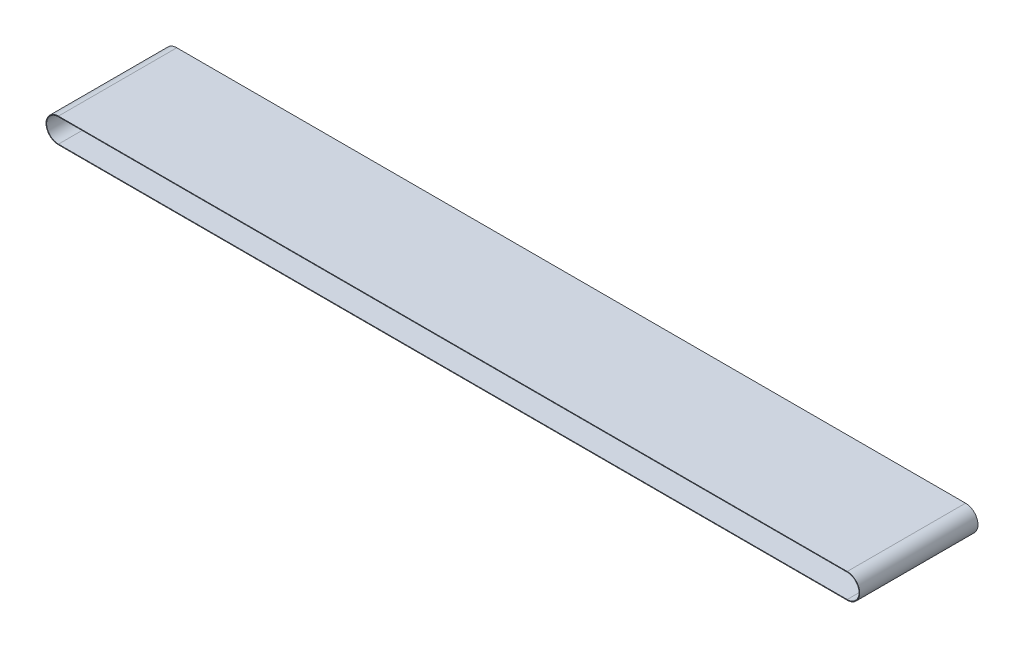
ISO-10303-21;
HEADER;
FILE_DESCRIPTION(('STEP AP214'),'2;1');
FILE_NAME('part.step','',(''),(''),'','','');
FILE_SCHEMA(('AUTOMOTIVE_DESIGN { 1 0 10303 214 1 1 1 1 }'));
ENDSEC;
DATA;
#1=APPLICATION_CONTEXT('core data for automotive mechanical design processes');
#2=APPLICATION_PROTOCOL_DEFINITION('international standard','automotive_design',2000,#1);
#3=PRODUCT_CONTEXT('',#1,'mechanical');
#4=PRODUCT('Part','Part','',(#3));
#5=PRODUCT_RELATED_PRODUCT_CATEGORY('part','',(#4));
#6=PRODUCT_DEFINITION_FORMATION('','',#4);
#7=PRODUCT_DEFINITION_CONTEXT('part definition',#1,'design');
#8=PRODUCT_DEFINITION('design','',#6,#7);
#9=PRODUCT_DEFINITION_SHAPE('','',#8);
#10=(LENGTH_UNIT() NAMED_UNIT(*) SI_UNIT(.MILLI.,.METRE.));
#11=(NAMED_UNIT(*) PLANE_ANGLE_UNIT() SI_UNIT($,.RADIAN.));
#12=(NAMED_UNIT(*) SI_UNIT($,.STERADIAN.) SOLID_ANGLE_UNIT());
#13=UNCERTAINTY_MEASURE_WITH_UNIT(LENGTH_MEASURE(1.E-05),#10,'distance_accuracy_value','');
#14=(GEOMETRIC_REPRESENTATION_CONTEXT(3) GLOBAL_UNCERTAINTY_ASSIGNED_CONTEXT((#13)) GLOBAL_UNIT_ASSIGNED_CONTEXT((#10,
#11,#12)) REPRESENTATION_CONTEXT('',''));
#15=CARTESIAN_POINT('',(0.,0.,0.));
#16=DIRECTION('',(0.,0.,1.));
#17=DIRECTION('',(1.,0.,0.));
#18=AXIS2_PLACEMENT_3D('',#15,#16,#17);
#19=CARTESIAN_POINT('',(0.,0.,75.));
#20=DIRECTION('',(0.,0.,1.));
#21=DIRECTION('',(1.,0.,0.));
#22=AXIS2_PLACEMENT_3D('',#19,#20,#21);
#23=PLANE('',#22);
#24=CARTESIAN_POINT('',(0.,0.,75.));
#25=DIRECTION('',(0.,0.,1.));
#26=DIRECTION('',(1.,0.,0.));
#27=AXIS2_PLACEMENT_3D('',#24,#25,#26);
#28=CIRCLE('',#27,15.8);
#29=CARTESIAN_POINT('',(0.,15.8,75.));
#30=VERTEX_POINT('',#29);
#31=CARTESIAN_POINT('',(0.,-15.8,75.));
#32=VERTEX_POINT('',#31);
#33=EDGE_CURVE('E135',#30,#32,#28,.T.);
#34=ORIENTED_EDGE('',*,*,#33,.T.);
#35=DIRECTION('',(1.,0.,0.));
#36=VECTOR('',#35,1.);
#37=CARTESIAN_POINT('',(0.,-15.8,75.));
#38=LINE('',#37,#36);
#39=CARTESIAN_POINT('',(1000.,-15.8,75.));
#40=VERTEX_POINT('',#39);
#41=EDGE_CURVE('E138',#32,#40,#38,.T.);
#42=ORIENTED_EDGE('',*,*,#41,.T.);
#43=CARTESIAN_POINT('',(1000.,0.,75.));
#44=DIRECTION('',(0.,0.,1.));
#45=DIRECTION('',(1.,0.,0.));
#46=AXIS2_PLACEMENT_3D('',#43,#44,#45);
#47=CIRCLE('',#46,15.8);
#48=CARTESIAN_POINT('',(1000.,15.8,75.));
#49=VERTEX_POINT('',#48);
#50=EDGE_CURVE('E141',#40,#49,#47,.T.);
#51=ORIENTED_EDGE('',*,*,#50,.T.);
#52=DIRECTION('',(-1.,0.,0.));
#53=VECTOR('',#52,1.);
#54=CARTESIAN_POINT('',(0.,15.8,75.));
#55=LINE('',#54,#53);
#56=EDGE_CURVE('E143',#49,#30,#55,.T.);
#57=ORIENTED_EDGE('',*,*,#56,.T.);
#58=EDGE_LOOP('',(#34,#42,#51,#57));
#59=FACE_BOUND('',#58,.T.);
#60=DIRECTION('',(1.,0.,0.));
#61=VECTOR('',#60,1.);
#62=CARTESIAN_POINT('',(0.,-15.,75.));
#63=LINE('',#62,#61);
#64=CARTESIAN_POINT('',(0.,-15.,75.));
#65=VERTEX_POINT('',#64);
#66=CARTESIAN_POINT('',(1000.,-15.,75.));
#67=VERTEX_POINT('',#66);
#68=EDGE_CURVE('E107',#65,#67,#63,.T.);
#69=ORIENTED_EDGE('',*,*,#68,.F.);
#70=CARTESIAN_POINT('',(0.,0.,75.));
#71=DIRECTION('',(0.,0.,1.));
#72=DIRECTION('',(1.,0.,0.));
#73=AXIS2_PLACEMENT_3D('',#70,#71,#72);
#74=CIRCLE('',#73,15.);
#75=CARTESIAN_POINT('',(0.,15.,75.));
#76=VERTEX_POINT('',#75);
#77=EDGE_CURVE('E99',#76,#65,#74,.T.);
#78=ORIENTED_EDGE('',*,*,#77,.F.);
#79=DIRECTION('',(-1.,0.,0.));
#80=VECTOR('',#79,1.);
#81=CARTESIAN_POINT('',(0.,15.,75.));
#82=LINE('',#81,#80);
#83=CARTESIAN_POINT('',(1000.,15.,75.));
#84=VERTEX_POINT('',#83);
#85=EDGE_CURVE('E121',#84,#76,#82,.T.);
#86=ORIENTED_EDGE('',*,*,#85,.F.);
#87=CARTESIAN_POINT('',(1000.,0.,75.));
#88=DIRECTION('',(0.,0.,1.));
#89=DIRECTION('',(1.,0.,0.));
#90=AXIS2_PLACEMENT_3D('',#87,#88,#89);
#91=CIRCLE('',#90,15.);
#92=EDGE_CURVE('E119',#67,#84,#91,.T.);
#93=ORIENTED_EDGE('',*,*,#92,.F.);
#94=EDGE_LOOP('',(#69,#78,#86,#93));
#95=FACE_BOUND('',#94,.T.);
#96=ADVANCED_FACE('F34',(#59,#95),#23,.T.);
#97=CARTESIAN_POINT('',(0.,0.,-75.));
#98=DIRECTION('',(0.,0.,1.));
#99=DIRECTION('',(1.,0.,0.));
#100=AXIS2_PLACEMENT_3D('',#97,#98,#99);
#101=PLANE('',#100);
#102=CARTESIAN_POINT('',(0.,0.,-75.));
#103=DIRECTION('',(0.,0.,1.));
#104=DIRECTION('',(1.,0.,0.));
#105=AXIS2_PLACEMENT_3D('',#102,#103,#104);
#106=CIRCLE('',#105,15.8);
#107=CARTESIAN_POINT('',(0.,15.8,-75.));
#108=VERTEX_POINT('',#107);
#109=CARTESIAN_POINT('',(0.,-15.8,-75.));
#110=VERTEX_POINT('',#109);
#111=EDGE_CURVE('E115',#108,#110,#106,.T.);
#112=ORIENTED_EDGE('',*,*,#111,.F.);
#113=DIRECTION('',(-1.,0.,0.));
#114=VECTOR('',#113,1.);
#115=CARTESIAN_POINT('',(0.,15.8,-75.));
#116=LINE('',#115,#114);
#117=CARTESIAN_POINT('',(1000.,15.8,-75.));
#118=VERTEX_POINT('',#117);
#119=EDGE_CURVE('E139',#118,#108,#116,.T.);
#120=ORIENTED_EDGE('',*,*,#119,.F.);
#121=CARTESIAN_POINT('',(1000.,0.,-75.));
#122=DIRECTION('',(0.,0.,1.));
#123=DIRECTION('',(1.,0.,0.));
#124=AXIS2_PLACEMENT_3D('',#121,#122,#123);
#125=CIRCLE('',#124,15.8);
#126=CARTESIAN_POINT('',(1000.,-15.8,-75.));
#127=VERTEX_POINT('',#126);
#128=EDGE_CURVE('E150',#127,#118,#125,.T.);
#129=ORIENTED_EDGE('',*,*,#128,.F.);
#130=DIRECTION('',(1.,0.,0.));
#131=VECTOR('',#130,1.);
#132=CARTESIAN_POINT('',(0.,-15.8,-75.));
#133=LINE('',#132,#131);
#134=EDGE_CURVE('E148',#110,#127,#133,.T.);
#135=ORIENTED_EDGE('',*,*,#134,.F.);
#136=EDGE_LOOP('',(#112,#120,#129,#135));
#137=FACE_BOUND('',#136,.T.);
#138=CARTESIAN_POINT('',(0.,0.,-75.));
#139=DIRECTION('',(0.,0.,1.));
#140=DIRECTION('',(1.,0.,0.));
#141=AXIS2_PLACEMENT_3D('',#138,#139,#140);
#142=CIRCLE('',#141,15.);
#143=CARTESIAN_POINT('',(0.,15.,-75.));
#144=VERTEX_POINT('',#143);
#145=CARTESIAN_POINT('',(0.,-15.,-75.));
#146=VERTEX_POINT('',#145);
#147=EDGE_CURVE('E57',#144,#146,#142,.T.);
#148=ORIENTED_EDGE('',*,*,#147,.T.);
#149=DIRECTION('',(1.,0.,0.));
#150=VECTOR('',#149,1.);
#151=CARTESIAN_POINT('',(0.,-15.,-75.));
#152=LINE('',#151,#150);
#153=CARTESIAN_POINT('',(1000.,-15.,-75.));
#154=VERTEX_POINT('',#153);
#155=EDGE_CURVE('E114',#146,#154,#152,.T.);
#156=ORIENTED_EDGE('',*,*,#155,.T.);
#157=CARTESIAN_POINT('',(1000.,0.,-75.));
#158=DIRECTION('',(0.,0.,1.));
#159=DIRECTION('',(1.,0.,0.));
#160=AXIS2_PLACEMENT_3D('',#157,#158,#159);
#161=CIRCLE('',#160,15.);
#162=CARTESIAN_POINT('',(1000.,15.,-75.));
#163=VERTEX_POINT('',#162);
#164=EDGE_CURVE('E127',#154,#163,#161,.T.);
#165=ORIENTED_EDGE('',*,*,#164,.T.);
#166=DIRECTION('',(-1.,0.,0.));
#167=VECTOR('',#166,1.);
#168=CARTESIAN_POINT('',(0.,15.,-75.));
#169=LINE('',#168,#167);
#170=EDGE_CURVE('E108',#163,#144,#169,.T.);
#171=ORIENTED_EDGE('',*,*,#170,.T.);
#172=EDGE_LOOP('',(#148,#156,#165,#171));
#173=FACE_BOUND('',#172,.T.);
#174=ADVANCED_FACE('F168',(#137,#173),#101,.F.);
#175=CARTESIAN_POINT('',(0.,0.,75.));
#176=DIRECTION('',(0.,0.,-1.));
#177=DIRECTION('',(-1.,0.,0.));
#178=AXIS2_PLACEMENT_3D('',#175,#176,#177);
#179=CYLINDRICAL_SURFACE('',#178,15.8);
#180=ORIENTED_EDGE('',*,*,#111,.T.);
#181=DIRECTION('',(0.,0.,-1.));
#182=VECTOR('',#181,1.);
#183=CARTESIAN_POINT('',(0.,-15.8,75.));
#184=LINE('',#183,#182);
#185=EDGE_CURVE('E11',#32,#110,#184,.T.);
#186=ORIENTED_EDGE('',*,*,#185,.F.);
#187=ORIENTED_EDGE('',*,*,#33,.F.);
#188=DIRECTION('',(0.,0.,-1.));
#189=VECTOR('',#188,1.);
#190=CARTESIAN_POINT('',(0.,15.8,75.));
#191=LINE('',#190,#189);
#192=EDGE_CURVE('E145',#30,#108,#191,.T.);
#193=ORIENTED_EDGE('',*,*,#192,.T.);
#194=EDGE_LOOP('',(#180,#186,#187,#193));
#195=FACE_BOUND('',#194,.T.);
#196=ADVANCED_FACE('F36',(#195),#179,.T.);
#197=CARTESIAN_POINT('',(0.,-15.8,75.));
#198=DIRECTION('',(0.,1.,0.));
#199=DIRECTION('',(0.,0.,1.));
#200=AXIS2_PLACEMENT_3D('',#197,#198,#199);
#201=PLANE('',#200);
#202=ORIENTED_EDGE('',*,*,#134,.T.);
#203=DIRECTION('',(0.,0.,-1.));
#204=VECTOR('',#203,1.);
#205=CARTESIAN_POINT('',(1000.,-15.8,75.));
#206=LINE('',#205,#204);
#207=EDGE_CURVE('E42',#40,#127,#206,.T.);
#208=ORIENTED_EDGE('',*,*,#207,.F.);
#209=ORIENTED_EDGE('',*,*,#41,.F.);
#210=ORIENTED_EDGE('',*,*,#185,.T.);
#211=EDGE_LOOP('',(#202,#208,#209,#210));
#212=FACE_BOUND('',#211,.T.);
#213=ADVANCED_FACE('F178',(#212),#201,.F.);
#214=CARTESIAN_POINT('',(1000.,0.,75.));
#215=DIRECTION('',(0.,0.,-1.));
#216=DIRECTION('',(-1.,0.,0.));
#217=AXIS2_PLACEMENT_3D('',#214,#215,#216);
#218=CYLINDRICAL_SURFACE('',#217,15.8);
#219=ORIENTED_EDGE('',*,*,#128,.T.);
#220=DIRECTION('',(0.,0.,-1.));
#221=VECTOR('',#220,1.);
#222=CARTESIAN_POINT('',(1000.,15.8,75.));
#223=LINE('',#222,#221);
#224=EDGE_CURVE('E155',#49,#118,#223,.T.);
#225=ORIENTED_EDGE('',*,*,#224,.F.);
#226=ORIENTED_EDGE('',*,*,#50,.F.);
#227=ORIENTED_EDGE('',*,*,#207,.T.);
#228=EDGE_LOOP('',(#219,#225,#226,#227));
#229=FACE_BOUND('',#228,.T.);
#230=ADVANCED_FACE('F162',(#229),#218,.T.);
#231=CARTESIAN_POINT('',(0.,15.8,75.));
#232=DIRECTION('',(0.,-1.,0.));
#233=DIRECTION('',(0.,0.,-1.));
#234=AXIS2_PLACEMENT_3D('',#231,#232,#233);
#235=PLANE('',#234);
#236=ORIENTED_EDGE('',*,*,#119,.T.);
#237=ORIENTED_EDGE('',*,*,#192,.F.);
#238=ORIENTED_EDGE('',*,*,#56,.F.);
#239=ORIENTED_EDGE('',*,*,#224,.T.);
#240=EDGE_LOOP('',(#236,#237,#238,#239));
#241=FACE_BOUND('',#240,.T.);
#242=ADVANCED_FACE('F172',(#241),#235,.F.);
#243=CARTESIAN_POINT('',(0.,0.,75.));
#244=DIRECTION('',(0.,0.,-1.));
#245=DIRECTION('',(-1.,0.,0.));
#246=AXIS2_PLACEMENT_3D('',#243,#244,#245);
#247=CYLINDRICAL_SURFACE('',#246,15.);
#248=ORIENTED_EDGE('',*,*,#147,.F.);
#249=DIRECTION('',(0.,0.,-1.));
#250=VECTOR('',#249,1.);
#251=CARTESIAN_POINT('',(0.,15.,75.));
#252=LINE('',#251,#250);
#253=EDGE_CURVE('E103',#76,#144,#252,.T.);
#254=ORIENTED_EDGE('',*,*,#253,.F.);
#255=ORIENTED_EDGE('',*,*,#77,.T.);
#256=DIRECTION('',(0.,0.,-1.));
#257=VECTOR('',#256,1.);
#258=CARTESIAN_POINT('',(0.,-15.,75.));
#259=LINE('',#258,#257);
#260=EDGE_CURVE('E102',#65,#146,#259,.T.);
#261=ORIENTED_EDGE('',*,*,#260,.T.);
#262=EDGE_LOOP('',(#248,#254,#255,#261));
#263=FACE_BOUND('',#262,.T.);
#264=ADVANCED_FACE('F101',(#263),#247,.F.);
#265=CARTESIAN_POINT('',(0.,-15.,75.));
#266=DIRECTION('',(0.,1.,0.));
#267=DIRECTION('',(0.,0.,1.));
#268=AXIS2_PLACEMENT_3D('',#265,#266,#267);
#269=PLANE('',#268);
#270=ORIENTED_EDGE('',*,*,#155,.F.);
#271=ORIENTED_EDGE('',*,*,#260,.F.);
#272=ORIENTED_EDGE('',*,*,#68,.T.);
#273=DIRECTION('',(0.,0.,-1.));
#274=VECTOR('',#273,1.);
#275=CARTESIAN_POINT('',(1000.,-15.,75.));
#276=LINE('',#275,#274);
#277=EDGE_CURVE('E116',#67,#154,#276,.T.);
#278=ORIENTED_EDGE('',*,*,#277,.T.);
#279=EDGE_LOOP('',(#270,#271,#272,#278));
#280=FACE_BOUND('',#279,.T.);
#281=ADVANCED_FACE('F111',(#280),#269,.T.);
#282=CARTESIAN_POINT('',(1000.,0.,75.));
#283=DIRECTION('',(0.,0.,-1.));
#284=DIRECTION('',(-1.,0.,0.));
#285=AXIS2_PLACEMENT_3D('',#282,#283,#284);
#286=CYLINDRICAL_SURFACE('',#285,15.);
#287=ORIENTED_EDGE('',*,*,#164,.F.);
#288=ORIENTED_EDGE('',*,*,#277,.F.);
#289=ORIENTED_EDGE('',*,*,#92,.T.);
#290=DIRECTION('',(0.,0.,-1.));
#291=VECTOR('',#290,1.);
#292=CARTESIAN_POINT('',(1000.,15.,75.));
#293=LINE('',#292,#291);
#294=EDGE_CURVE('E49',#84,#163,#293,.T.);
#295=ORIENTED_EDGE('',*,*,#294,.T.);
#296=EDGE_LOOP('',(#287,#288,#289,#295));
#297=FACE_BOUND('',#296,.T.);
#298=ADVANCED_FACE('F201',(#297),#286,.F.);
#299=CARTESIAN_POINT('',(0.,15.,75.));
#300=DIRECTION('',(0.,-1.,0.));
#301=DIRECTION('',(0.,0.,-1.));
#302=AXIS2_PLACEMENT_3D('',#299,#300,#301);
#303=PLANE('',#302);
#304=ORIENTED_EDGE('',*,*,#170,.F.);
#305=ORIENTED_EDGE('',*,*,#294,.F.);
#306=ORIENTED_EDGE('',*,*,#85,.T.);
#307=ORIENTED_EDGE('',*,*,#253,.T.);
#308=EDGE_LOOP('',(#304,#305,#306,#307));
#309=FACE_BOUND('',#308,.T.);
#310=ADVANCED_FACE('F205',(#309),#303,.T.);
#311=CLOSED_SHELL('',(#96,#174,#196,#213,#230,#242,#264,#281,#298,#310));
#312=MANIFOLD_SOLID_BREP('B2',#311);
#313=ADVANCED_BREP_SHAPE_REPRESENTATION('',(#18,#312),#14);
#314=SHAPE_DEFINITION_REPRESENTATION(#9,#313);
ENDSEC;
END-ISO-10303-21;
